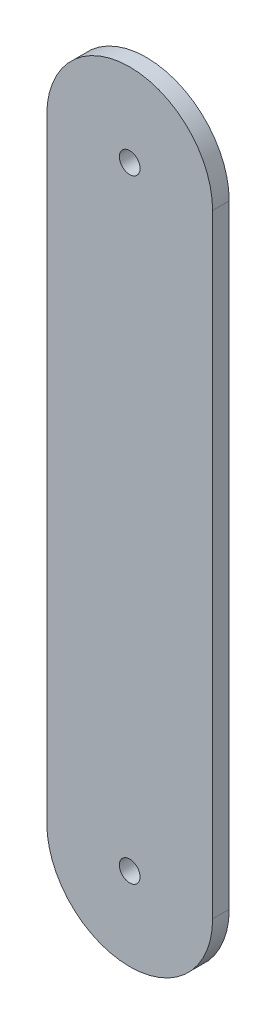
ISO-10303-21;
HEADER;
FILE_DESCRIPTION(('STEP AP214'),'2;1');
FILE_NAME('part.step','',(''),(''),'','','');
FILE_SCHEMA(('AUTOMOTIVE_DESIGN { 1 0 10303 214 1 1 1 1 }'));
ENDSEC;
DATA;
#1=APPLICATION_CONTEXT('core data for automotive mechanical design processes');
#2=APPLICATION_PROTOCOL_DEFINITION('international standard','automotive_design',2000,#1);
#3=PRODUCT_CONTEXT('',#1,'mechanical');
#4=PRODUCT('Part','Part','',(#3));
#5=PRODUCT_RELATED_PRODUCT_CATEGORY('part','',(#4));
#6=PRODUCT_DEFINITION_FORMATION('','',#4);
#7=PRODUCT_DEFINITION_CONTEXT('part definition',#1,'design');
#8=PRODUCT_DEFINITION('design','',#6,#7);
#9=PRODUCT_DEFINITION_SHAPE('','',#8);
#10=(LENGTH_UNIT() NAMED_UNIT(*) SI_UNIT(.MILLI.,.METRE.));
#11=(NAMED_UNIT(*) PLANE_ANGLE_UNIT() SI_UNIT($,.RADIAN.));
#12=(NAMED_UNIT(*) SI_UNIT($,.STERADIAN.) SOLID_ANGLE_UNIT());
#13=UNCERTAINTY_MEASURE_WITH_UNIT(LENGTH_MEASURE(1.E-05),#10,'distance_accuracy_value','');
#14=(GEOMETRIC_REPRESENTATION_CONTEXT(3) GLOBAL_UNCERTAINTY_ASSIGNED_CONTEXT((#13)) GLOBAL_UNIT_ASSIGNED_CONTEXT((#10,
#11,#12)) REPRESENTATION_CONTEXT('',''));
#15=CARTESIAN_POINT('',(0.,0.,0.));
#16=DIRECTION('',(0.,0.,1.));
#17=DIRECTION('',(1.,0.,0.));
#18=AXIS2_PLACEMENT_3D('',#15,#16,#17);
#19=CARTESIAN_POINT('',(-18.6833790479199,37.2568238213399,2.));
#20=DIRECTION('',(0.,0.,1.));
#21=DIRECTION('',(1.,0.,0.));
#22=AXIS2_PLACEMENT_3D('',#19,#20,#21);
#23=PLANE('',#22);
#24=CARTESIAN_POINT('',(-18.6833790479199,37.2568238213399,2.));
#25=DIRECTION('',(0.,0.,1.));
#26=DIRECTION('',(1.,0.,0.));
#27=AXIS2_PLACEMENT_3D('',#24,#25,#26);
#28=CIRCLE('',#27,1.25);
#29=CARTESIAN_POINT('',(-17.4333790479199,37.2568238213399,2.));
#30=VERTEX_POINT('',#29);
#31=EDGE_CURVE('E99',#30,#30,#28,.T.);
#32=ORIENTED_EDGE('',*,*,#31,.F.);
#33=EDGE_LOOP('',(#32));
#34=FACE_BOUND('',#33,.T.);
#35=CARTESIAN_POINT('',(-18.6833790479199,37.2568238213399,2.));
#36=DIRECTION('',(0.,0.,1.));
#37=DIRECTION('',(1.,0.,0.));
#38=AXIS2_PLACEMENT_3D('',#35,#36,#37);
#39=CIRCLE('',#38,10.);
#40=CARTESIAN_POINT('',(-8.68337904791992,37.2568238213399,2.));
#41=VERTEX_POINT('',#40);
#42=CARTESIAN_POINT('',(-28.6833790479199,37.2568238213399,2.));
#43=VERTEX_POINT('',#42);
#44=EDGE_CURVE('E84',#41,#43,#39,.T.);
#45=ORIENTED_EDGE('',*,*,#44,.T.);
#46=DIRECTION('',(0.,-1.,0.));
#47=VECTOR('',#46,1.);
#48=CARTESIAN_POINT('',(-28.6833790479199,37.2568238213399,2.));
#49=LINE('',#48,#47);
#50=CARTESIAN_POINT('',(-28.6833790479199,-36.7431761786601,2.));
#51=VERTEX_POINT('',#50);
#52=EDGE_CURVE('E79',#43,#51,#49,.T.);
#53=ORIENTED_EDGE('',*,*,#52,.T.);
#54=CARTESIAN_POINT('',(-18.6833790479199,-36.7431761786601,2.));
#55=DIRECTION('',(0.,0.,1.));
#56=DIRECTION('',(-1.,0.,0.));
#57=AXIS2_PLACEMENT_3D('',#54,#55,#56);
#58=CIRCLE('',#57,10.);
#59=CARTESIAN_POINT('',(-8.68337904791991,-36.7431761786601,2.));
#60=VERTEX_POINT('',#59);
#61=EDGE_CURVE('E82',#51,#60,#58,.T.);
#62=ORIENTED_EDGE('',*,*,#61,.T.);
#63=DIRECTION('',(0.,1.,0.));
#64=VECTOR('',#63,1.);
#65=CARTESIAN_POINT('',(-8.68337904791992,37.2568238213399,2.));
#66=LINE('',#65,#64);
#67=EDGE_CURVE('E49',#60,#41,#66,.T.);
#68=ORIENTED_EDGE('',*,*,#67,.T.);
#69=EDGE_LOOP('',(#45,#53,#62,#68));
#70=FACE_BOUND('',#69,.T.);
#71=CARTESIAN_POINT('',(-18.6833790479199,-36.7431761786601,2.));
#72=DIRECTION('',(0.,0.,1.));
#73=DIRECTION('',(1.,0.,0.));
#74=AXIS2_PLACEMENT_3D('',#71,#72,#73);
#75=CIRCLE('',#74,1.25);
#76=CARTESIAN_POINT('',(-17.4333790479199,-36.7431761786601,2.));
#77=VERTEX_POINT('',#76);
#78=EDGE_CURVE('E114',#77,#77,#75,.T.);
#79=ORIENTED_EDGE('',*,*,#78,.F.);
#80=EDGE_LOOP('',(#79));
#81=FACE_BOUND('',#80,.T.);
#82=ADVANCED_FACE('F32',(#34,#70,#81),#23,.T.);
#83=CARTESIAN_POINT('',(-18.6833790479199,37.2568238213399,0.));
#84=DIRECTION('',(0.,0.,1.));
#85=DIRECTION('',(1.,0.,0.));
#86=AXIS2_PLACEMENT_3D('',#83,#84,#85);
#87=PLANE('',#86);
#88=CARTESIAN_POINT('',(-18.6833790479199,37.2568238213399,0.));
#89=DIRECTION('',(0.,0.,1.));
#90=DIRECTION('',(1.,0.,0.));
#91=AXIS2_PLACEMENT_3D('',#88,#89,#90);
#92=CIRCLE('',#91,10.);
#93=CARTESIAN_POINT('',(-8.68337904791992,37.2568238213399,0.));
#94=VERTEX_POINT('',#93);
#95=CARTESIAN_POINT('',(-28.6833790479199,37.2568238213399,0.));
#96=VERTEX_POINT('',#95);
#97=EDGE_CURVE('E96',#94,#96,#92,.T.);
#98=ORIENTED_EDGE('',*,*,#97,.F.);
#99=DIRECTION('',(0.,1.,0.));
#100=VECTOR('',#99,1.);
#101=CARTESIAN_POINT('',(-8.68337904791992,37.2568238213399,0.));
#102=LINE('',#101,#100);
#103=CARTESIAN_POINT('',(-8.68337904791991,-36.7431761786601,0.));
#104=VERTEX_POINT('',#103);
#105=EDGE_CURVE('E72',#104,#94,#102,.T.);
#106=ORIENTED_EDGE('',*,*,#105,.F.);
#107=CARTESIAN_POINT('',(-18.6833790479199,-36.7431761786601,0.));
#108=DIRECTION('',(0.,0.,1.));
#109=DIRECTION('',(-1.,0.,0.));
#110=AXIS2_PLACEMENT_3D('',#107,#108,#109);
#111=CIRCLE('',#110,10.);
#112=CARTESIAN_POINT('',(-28.6833790479199,-36.7431761786601,0.));
#113=VERTEX_POINT('',#112);
#114=EDGE_CURVE('E66',#113,#104,#111,.T.);
#115=ORIENTED_EDGE('',*,*,#114,.F.);
#116=DIRECTION('',(0.,-1.,0.));
#117=VECTOR('',#116,1.);
#118=CARTESIAN_POINT('',(-28.6833790479199,37.2568238213399,0.));
#119=LINE('',#118,#117);
#120=EDGE_CURVE('E88',#96,#113,#119,.T.);
#121=ORIENTED_EDGE('',*,*,#120,.F.);
#122=EDGE_LOOP('',(#98,#106,#115,#121));
#123=FACE_BOUND('',#122,.T.);
#124=CARTESIAN_POINT('',(-18.6833790479199,37.2568238213399,0.));
#125=DIRECTION('',(0.,0.,1.));
#126=DIRECTION('',(1.,0.,0.));
#127=AXIS2_PLACEMENT_3D('',#124,#125,#126);
#128=CIRCLE('',#127,1.25);
#129=CARTESIAN_POINT('',(-17.4333790479199,37.2568238213399,0.));
#130=VERTEX_POINT('',#129);
#131=EDGE_CURVE('E111',#130,#130,#128,.T.);
#132=ORIENTED_EDGE('',*,*,#131,.T.);
#133=EDGE_LOOP('',(#132));
#134=FACE_BOUND('',#133,.T.);
#135=CARTESIAN_POINT('',(-18.6833790479199,-36.7431761786601,0.));
#136=DIRECTION('',(0.,0.,1.));
#137=DIRECTION('',(1.,0.,0.));
#138=AXIS2_PLACEMENT_3D('',#135,#136,#137);
#139=CIRCLE('',#138,1.25);
#140=CARTESIAN_POINT('',(-17.4333790479199,-36.7431761786601,0.));
#141=VERTEX_POINT('',#140);
#142=EDGE_CURVE('E117',#141,#141,#139,.T.);
#143=ORIENTED_EDGE('',*,*,#142,.T.);
#144=EDGE_LOOP('',(#143));
#145=FACE_BOUND('',#144,.T.);
#146=ADVANCED_FACE('F107',(#123,#134,#145),#87,.F.);
#147=CARTESIAN_POINT('',(-18.6833790479199,37.2568238213399,2.));
#148=DIRECTION('',(0.,0.,-1.));
#149=DIRECTION('',(-1.,0.,0.));
#150=AXIS2_PLACEMENT_3D('',#147,#148,#149);
#151=CYLINDRICAL_SURFACE('',#150,10.);
#152=ORIENTED_EDGE('',*,*,#97,.T.);
#153=DIRECTION('',(0.,0.,-1.));
#154=VECTOR('',#153,1.);
#155=CARTESIAN_POINT('',(-28.6833790479199,37.2568238213399,2.));
#156=LINE('',#155,#154);
#157=EDGE_CURVE('E11',#43,#96,#156,.T.);
#158=ORIENTED_EDGE('',*,*,#157,.F.);
#159=ORIENTED_EDGE('',*,*,#44,.F.);
#160=DIRECTION('',(0.,0.,-1.));
#161=VECTOR('',#160,1.);
#162=CARTESIAN_POINT('',(-8.68337904791992,37.2568238213399,2.));
#163=LINE('',#162,#161);
#164=EDGE_CURVE('E92',#41,#94,#163,.T.);
#165=ORIENTED_EDGE('',*,*,#164,.T.);
#166=EDGE_LOOP('',(#152,#158,#159,#165));
#167=FACE_BOUND('',#166,.T.);
#168=ADVANCED_FACE('F34',(#167),#151,.T.);
#169=CARTESIAN_POINT('',(-28.6833790479199,37.2568238213399,2.));
#170=DIRECTION('',(1.,0.,0.));
#171=DIRECTION('',(0.,1.,0.));
#172=AXIS2_PLACEMENT_3D('',#169,#170,#171);
#173=PLANE('',#172);
#174=ORIENTED_EDGE('',*,*,#120,.T.);
#175=DIRECTION('',(0.,0.,-1.));
#176=VECTOR('',#175,1.);
#177=CARTESIAN_POINT('',(-28.6833790479199,-36.7431761786601,2.));
#178=LINE('',#177,#176);
#179=EDGE_CURVE('E41',#51,#113,#178,.T.);
#180=ORIENTED_EDGE('',*,*,#179,.F.);
#181=ORIENTED_EDGE('',*,*,#52,.F.);
#182=ORIENTED_EDGE('',*,*,#157,.T.);
#183=EDGE_LOOP('',(#174,#180,#181,#182));
#184=FACE_BOUND('',#183,.T.);
#185=ADVANCED_FACE('F87',(#184),#173,.F.);
#186=CARTESIAN_POINT('',(-18.6833790479199,-36.7431761786601,2.));
#187=DIRECTION('',(0.,0.,-1.));
#188=DIRECTION('',(-1.,0.,0.));
#189=AXIS2_PLACEMENT_3D('',#186,#187,#188);
#190=CYLINDRICAL_SURFACE('',#189,10.);
#191=ORIENTED_EDGE('',*,*,#114,.T.);
#192=DIRECTION('',(0.,0.,-1.));
#193=VECTOR('',#192,1.);
#194=CARTESIAN_POINT('',(-8.68337904791991,-36.7431761786601,2.));
#195=LINE('',#194,#193);
#196=EDGE_CURVE('E89',#60,#104,#195,.T.);
#197=ORIENTED_EDGE('',*,*,#196,.F.);
#198=ORIENTED_EDGE('',*,*,#61,.F.);
#199=ORIENTED_EDGE('',*,*,#179,.T.);
#200=EDGE_LOOP('',(#191,#197,#198,#199));
#201=FACE_BOUND('',#200,.T.);
#202=ADVANCED_FACE('F90',(#201),#190,.T.);
#203=CARTESIAN_POINT('',(-8.68337904791992,37.2568238213399,2.));
#204=DIRECTION('',(-1.,0.,0.));
#205=DIRECTION('',(0.,-1.,0.));
#206=AXIS2_PLACEMENT_3D('',#203,#204,#205);
#207=PLANE('',#206);
#208=ORIENTED_EDGE('',*,*,#105,.T.);
#209=ORIENTED_EDGE('',*,*,#164,.F.);
#210=ORIENTED_EDGE('',*,*,#67,.F.);
#211=ORIENTED_EDGE('',*,*,#196,.T.);
#212=EDGE_LOOP('',(#208,#209,#210,#211));
#213=FACE_BOUND('',#212,.T.);
#214=ADVANCED_FACE('F104',(#213),#207,.F.);
#215=CARTESIAN_POINT('',(-18.6833790479199,37.2568238213399,2.));
#216=DIRECTION('',(0.,0.,-1.));
#217=DIRECTION('',(-1.,0.,0.));
#218=AXIS2_PLACEMENT_3D('',#215,#216,#217);
#219=CYLINDRICAL_SURFACE('',#218,1.25);
#220=ORIENTED_EDGE('',*,*,#31,.T.);
#221=EDGE_LOOP('',(#220));
#222=FACE_BOUND('',#221,.T.);
#223=ORIENTED_EDGE('',*,*,#131,.F.);
#224=EDGE_LOOP('',(#223));
#225=FACE_BOUND('',#224,.T.);
#226=ADVANCED_FACE('F134',(#222,#225),#219,.F.);
#227=CARTESIAN_POINT('',(-18.6833790479199,-36.7431761786601,2.));
#228=DIRECTION('',(0.,0.,-1.));
#229=DIRECTION('',(-1.,0.,0.));
#230=AXIS2_PLACEMENT_3D('',#227,#228,#229);
#231=CYLINDRICAL_SURFACE('',#230,1.25);
#232=ORIENTED_EDGE('',*,*,#78,.T.);
#233=EDGE_LOOP('',(#232));
#234=FACE_BOUND('',#233,.T.);
#235=ORIENTED_EDGE('',*,*,#142,.F.);
#236=EDGE_LOOP('',(#235));
#237=FACE_BOUND('',#236,.T.);
#238=ADVANCED_FACE('F123',(#234,#237),#231,.F.);
#239=CLOSED_SHELL('',(#82,#146,#168,#185,#202,#214,#226,#238));
#240=MANIFOLD_SOLID_BREP('B2',#239);
#241=ADVANCED_BREP_SHAPE_REPRESENTATION('',(#18,#240),#14);
#242=SHAPE_DEFINITION_REPRESENTATION(#9,#241);
ENDSEC;
END-ISO-10303-21;
